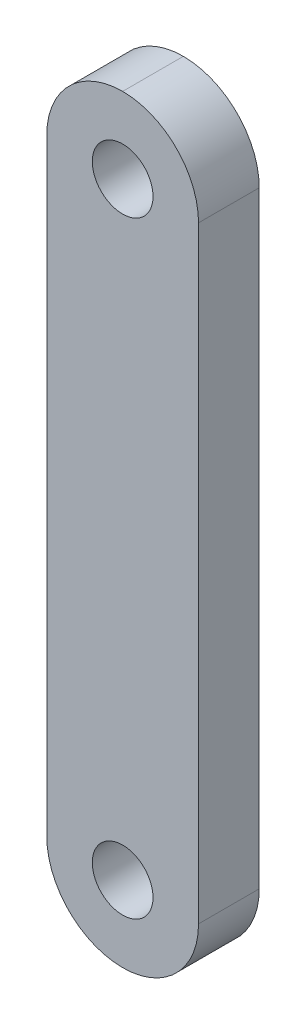
ISO-10303-21;
HEADER;
FILE_DESCRIPTION(('STEP AP214'),'2;1');
FILE_NAME('part.step','',(''),(''),'','','');
FILE_SCHEMA(('AUTOMOTIVE_DESIGN { 1 0 10303 214 1 1 1 1 }'));
ENDSEC;
DATA;
#1=APPLICATION_CONTEXT('core data for automotive mechanical design processes');
#2=APPLICATION_PROTOCOL_DEFINITION('international standard','automotive_design',2000,#1);
#3=PRODUCT_CONTEXT('',#1,'mechanical');
#4=PRODUCT('Part','Part','',(#3));
#5=PRODUCT_RELATED_PRODUCT_CATEGORY('part','',(#4));
#6=PRODUCT_DEFINITION_FORMATION('','',#4);
#7=PRODUCT_DEFINITION_CONTEXT('part definition',#1,'design');
#8=PRODUCT_DEFINITION('design','',#6,#7);
#9=PRODUCT_DEFINITION_SHAPE('','',#8);
#10=(LENGTH_UNIT() NAMED_UNIT(*) SI_UNIT(.MILLI.,.METRE.));
#11=(NAMED_UNIT(*) PLANE_ANGLE_UNIT() SI_UNIT($,.RADIAN.));
#12=(NAMED_UNIT(*) SI_UNIT($,.STERADIAN.) SOLID_ANGLE_UNIT());
#13=UNCERTAINTY_MEASURE_WITH_UNIT(LENGTH_MEASURE(1.E-05),#10,'distance_accuracy_value','');
#14=(GEOMETRIC_REPRESENTATION_CONTEXT(3) GLOBAL_UNCERTAINTY_ASSIGNED_CONTEXT((#13)) GLOBAL_UNIT_ASSIGNED_CONTEXT((#10,
#11,#12)) REPRESENTATION_CONTEXT('',''));
#15=CARTESIAN_POINT('',(0.,0.,0.));
#16=DIRECTION('',(0.,0.,1.));
#17=DIRECTION('',(1.,0.,0.));
#18=AXIS2_PLACEMENT_3D('',#15,#16,#17);
#19=CARTESIAN_POINT('',(-25.,-125.,20.));
#20=DIRECTION('',(1.,0.,0.));
#21=DIRECTION('',(0.,0.,-1.));
#22=AXIS2_PLACEMENT_3D('',#19,#20,#21);
#23=PLANE('',#22);
#24=DIRECTION('',(0.,-1.,0.));
#25=VECTOR('',#24,1.);
#26=CARTESIAN_POINT('',(-25.,-125.,0.));
#27=LINE('',#26,#25);
#28=CARTESIAN_POINT('',(-25.,100.,0.));
#29=VERTEX_POINT('',#28);
#30=CARTESIAN_POINT('',(-25.,-100.,0.));
#31=VERTEX_POINT('',#30);
#32=EDGE_CURVE('E102',#29,#31,#27,.T.);
#33=ORIENTED_EDGE('',*,*,#32,.T.);
#34=DIRECTION('',(0.,0.,-1.));
#35=VECTOR('',#34,1.);
#36=CARTESIAN_POINT('',(-25.,-100.,20.));
#37=LINE('',#36,#35);
#38=CARTESIAN_POINT('',(-25.,-100.,20.));
#39=VERTEX_POINT('',#38);
#40=EDGE_CURVE('E106',#31,#39,#37,.F.);
#41=ORIENTED_EDGE('',*,*,#40,.T.);
#42=DIRECTION('',(0.,-1.,0.));
#43=VECTOR('',#42,1.);
#44=CARTESIAN_POINT('',(-25.,-125.,20.));
#45=LINE('',#44,#43);
#46=CARTESIAN_POINT('',(-25.,100.,20.));
#47=VERTEX_POINT('',#46);
#48=EDGE_CURVE('E105',#47,#39,#45,.T.);
#49=ORIENTED_EDGE('',*,*,#48,.F.);
#50=DIRECTION('',(0.,0.,-1.));
#51=VECTOR('',#50,1.);
#52=CARTESIAN_POINT('',(-25.,100.,20.));
#53=LINE('',#52,#51);
#54=EDGE_CURVE('E91',#47,#29,#53,.T.);
#55=ORIENTED_EDGE('',*,*,#54,.T.);
#56=EDGE_LOOP('',(#33,#41,#49,#55));
#57=FACE_BOUND('',#56,.T.);
#58=ADVANCED_FACE('F32',(#57),#23,.F.);
#59=CARTESIAN_POINT('',(25.,-125.,20.));
#60=DIRECTION('',(-1.,0.,0.));
#61=DIRECTION('',(0.,0.,1.));
#62=AXIS2_PLACEMENT_3D('',#59,#60,#61);
#63=PLANE('',#62);
#64=DIRECTION('',(0.,1.,0.));
#65=VECTOR('',#64,1.);
#66=CARTESIAN_POINT('',(25.,-125.,20.));
#67=LINE('',#66,#65);
#68=CARTESIAN_POINT('',(25.,-100.,20.));
#69=VERTEX_POINT('',#68);
#70=CARTESIAN_POINT('',(25.,100.,20.));
#71=VERTEX_POINT('',#70);
#72=EDGE_CURVE('E119',#69,#71,#67,.T.);
#73=ORIENTED_EDGE('',*,*,#72,.F.);
#74=DIRECTION('',(0.,0.,-1.));
#75=VECTOR('',#74,1.);
#76=CARTESIAN_POINT('',(25.,-100.,20.));
#77=LINE('',#76,#75);
#78=CARTESIAN_POINT('',(25.,-100.,0.));
#79=VERTEX_POINT('',#78);
#80=EDGE_CURVE('E11',#69,#79,#77,.T.);
#81=ORIENTED_EDGE('',*,*,#80,.T.);
#82=DIRECTION('',(0.,1.,0.));
#83=VECTOR('',#82,1.);
#84=CARTESIAN_POINT('',(25.,-125.,0.));
#85=LINE('',#84,#83);
#86=CARTESIAN_POINT('',(25.,100.,0.));
#87=VERTEX_POINT('',#86);
#88=EDGE_CURVE('E111',#79,#87,#85,.T.);
#89=ORIENTED_EDGE('',*,*,#88,.T.);
#90=DIRECTION('',(0.,0.,-1.));
#91=VECTOR('',#90,1.);
#92=CARTESIAN_POINT('',(25.,100.,20.));
#93=LINE('',#92,#91);
#94=EDGE_CURVE('E41',#87,#71,#93,.F.);
#95=ORIENTED_EDGE('',*,*,#94,.T.);
#96=EDGE_LOOP('',(#73,#81,#89,#95));
#97=FACE_BOUND('',#96,.T.);
#98=ADVANCED_FACE('F153',(#97),#63,.F.);
#99=CARTESIAN_POINT('',(0.,0.,20.));
#100=DIRECTION('',(0.,0.,-1.));
#101=DIRECTION('',(-1.,0.,0.));
#102=AXIS2_PLACEMENT_3D('',#99,#100,#101);
#103=PLANE('',#102);
#104=CARTESIAN_POINT('',(0.,100.,20.));
#105=DIRECTION('',(0.,0.,1.));
#106=DIRECTION('',(1.,0.,0.));
#107=AXIS2_PLACEMENT_3D('',#104,#105,#106);
#108=CIRCLE('',#107,10.);
#109=CARTESIAN_POINT('',(10.,100.,20.));
#110=VERTEX_POINT('',#109);
#111=EDGE_CURVE('E139',#110,#110,#108,.T.);
#112=ORIENTED_EDGE('',*,*,#111,.F.);
#113=EDGE_LOOP('',(#112));
#114=FACE_BOUND('',#113,.T.);
#115=CARTESIAN_POINT('',(0.,-100.,20.));
#116=DIRECTION('',(0.,0.,1.));
#117=DIRECTION('',(1.,0.,0.));
#118=AXIS2_PLACEMENT_3D('',#115,#116,#117);
#119=CIRCLE('',#118,10.);
#120=CARTESIAN_POINT('',(10.,-100.,20.));
#121=VERTEX_POINT('',#120);
#122=EDGE_CURVE('E112',#121,#121,#119,.T.);
#123=ORIENTED_EDGE('',*,*,#122,.F.);
#124=EDGE_LOOP('',(#123));
#125=FACE_BOUND('',#124,.T.);
#126=ORIENTED_EDGE('',*,*,#48,.T.);
#127=CARTESIAN_POINT('',(0.,-100.,20.));
#128=DIRECTION('',(0.,0.,-1.));
#129=DIRECTION('',(-1.,0.,0.));
#130=AXIS2_PLACEMENT_3D('',#127,#128,#129);
#131=CIRCLE('',#130,25.);
#132=CARTESIAN_POINT('',(0.,-125.,20.));
#133=VERTEX_POINT('',#132);
#134=EDGE_CURVE('E131',#39,#133,#131,.F.);
#135=ORIENTED_EDGE('',*,*,#134,.T.);
#136=CARTESIAN_POINT('',(0.,-100.,20.));
#137=DIRECTION('',(0.,0.,-1.));
#138=DIRECTION('',(-1.,0.,0.));
#139=AXIS2_PLACEMENT_3D('',#136,#137,#138);
#140=CIRCLE('',#139,25.);
#141=EDGE_CURVE('E129',#133,#69,#140,.F.);
#142=ORIENTED_EDGE('',*,*,#141,.T.);
#143=ORIENTED_EDGE('',*,*,#72,.T.);
#144=CARTESIAN_POINT('',(0.,100.,20.));
#145=DIRECTION('',(0.,0.,-1.));
#146=DIRECTION('',(-1.,0.,0.));
#147=AXIS2_PLACEMENT_3D('',#144,#145,#146);
#148=CIRCLE('',#147,25.);
#149=CARTESIAN_POINT('',(0.,125.,20.));
#150=VERTEX_POINT('',#149);
#151=EDGE_CURVE('E49',#71,#150,#148,.F.);
#152=ORIENTED_EDGE('',*,*,#151,.T.);
#153=CARTESIAN_POINT('',(0.,100.,20.));
#154=DIRECTION('',(0.,0.,-1.));
#155=DIRECTION('',(-1.,0.,0.));
#156=AXIS2_PLACEMENT_3D('',#153,#154,#155);
#157=CIRCLE('',#156,25.);
#158=EDGE_CURVE('E127',#150,#47,#157,.F.);
#159=ORIENTED_EDGE('',*,*,#158,.T.);
#160=EDGE_LOOP('',(#126,#135,#142,#143,#152,#159));
#161=FACE_BOUND('',#160,.T.);
#162=ADVANCED_FACE('F147',(#114,#125,#161),#103,.F.);
#163=CARTESIAN_POINT('',(0.,0.,0.));
#164=DIRECTION('',(0.,0.,-1.));
#165=DIRECTION('',(-1.,0.,0.));
#166=AXIS2_PLACEMENT_3D('',#163,#164,#165);
#167=PLANE('',#166);
#168=CARTESIAN_POINT('',(0.,100.,0.));
#169=DIRECTION('',(0.,0.,-1.));
#170=DIRECTION('',(-1.,0.,0.));
#171=AXIS2_PLACEMENT_3D('',#168,#169,#170);
#172=CIRCLE('',#171,10.);
#173=CARTESIAN_POINT('',(-10.,100.,0.));
#174=VERTEX_POINT('',#173);
#175=EDGE_CURVE('E135',#174,#174,#172,.F.);
#176=ORIENTED_EDGE('',*,*,#175,.T.);
#177=EDGE_LOOP('',(#176));
#178=FACE_BOUND('',#177,.T.);
#179=CARTESIAN_POINT('',(0.,-100.,0.));
#180=DIRECTION('',(0.,0.,-1.));
#181=DIRECTION('',(-1.,0.,0.));
#182=AXIS2_PLACEMENT_3D('',#179,#180,#181);
#183=CIRCLE('',#182,10.);
#184=CARTESIAN_POINT('',(-10.,-100.,0.));
#185=VERTEX_POINT('',#184);
#186=EDGE_CURVE('E116',#185,#185,#183,.F.);
#187=ORIENTED_EDGE('',*,*,#186,.T.);
#188=EDGE_LOOP('',(#187));
#189=FACE_BOUND('',#188,.T.);
#190=CARTESIAN_POINT('',(0.,-100.,0.));
#191=DIRECTION('',(0.,0.,-1.));
#192=DIRECTION('',(-1.,0.,0.));
#193=AXIS2_PLACEMENT_3D('',#190,#191,#192);
#194=CIRCLE('',#193,25.);
#195=CARTESIAN_POINT('',(0.,-125.,0.));
#196=VERTEX_POINT('',#195);
#197=EDGE_CURVE('E95',#79,#196,#194,.T.);
#198=ORIENTED_EDGE('',*,*,#197,.T.);
#199=CARTESIAN_POINT('',(0.,-100.,0.));
#200=DIRECTION('',(0.,0.,-1.));
#201=DIRECTION('',(-1.,0.,0.));
#202=AXIS2_PLACEMENT_3D('',#199,#200,#201);
#203=CIRCLE('',#202,25.);
#204=EDGE_CURVE('E107',#196,#31,#203,.T.);
#205=ORIENTED_EDGE('',*,*,#204,.T.);
#206=ORIENTED_EDGE('',*,*,#32,.F.);
#207=CARTESIAN_POINT('',(0.,100.,0.));
#208=DIRECTION('',(0.,0.,-1.));
#209=DIRECTION('',(-1.,0.,0.));
#210=AXIS2_PLACEMENT_3D('',#207,#208,#209);
#211=CIRCLE('',#210,25.);
#212=CARTESIAN_POINT('',(0.,125.,0.));
#213=VERTEX_POINT('',#212);
#214=EDGE_CURVE('E87',#29,#213,#211,.T.);
#215=ORIENTED_EDGE('',*,*,#214,.T.);
#216=CARTESIAN_POINT('',(0.,100.,0.));
#217=DIRECTION('',(0.,0.,-1.));
#218=DIRECTION('',(-1.,0.,0.));
#219=AXIS2_PLACEMENT_3D('',#216,#217,#218);
#220=CIRCLE('',#219,25.);
#221=EDGE_CURVE('E96',#213,#87,#220,.T.);
#222=ORIENTED_EDGE('',*,*,#221,.T.);
#223=ORIENTED_EDGE('',*,*,#88,.F.);
#224=EDGE_LOOP('',(#198,#205,#206,#215,#222,#223));
#225=FACE_BOUND('',#224,.T.);
#226=ADVANCED_FACE('F109',(#178,#189,#225),#167,.T.);
#227=CARTESIAN_POINT('',(0.,-100.,-0.001000000000001));
#228=DIRECTION('',(0.,0.,1.));
#229=DIRECTION('',(1.,0.,0.));
#230=AXIS2_PLACEMENT_3D('',#227,#228,#229);
#231=CYLINDRICAL_SURFACE('',#230,10.);
#232=ORIENTED_EDGE('',*,*,#186,.F.);
#233=EDGE_LOOP('',(#232));
#234=FACE_BOUND('',#233,.T.);
#235=ORIENTED_EDGE('',*,*,#122,.T.);
#236=EDGE_LOOP('',(#235));
#237=FACE_BOUND('',#236,.T.);
#238=ADVANCED_FACE('F174',(#234,#237),#231,.F.);
#239=CARTESIAN_POINT('',(0.,100.,-0.001000000000001));
#240=DIRECTION('',(0.,0.,1.));
#241=DIRECTION('',(1.,0.,0.));
#242=AXIS2_PLACEMENT_3D('',#239,#240,#241);
#243=CYLINDRICAL_SURFACE('',#242,10.);
#244=ORIENTED_EDGE('',*,*,#175,.F.);
#245=EDGE_LOOP('',(#244));
#246=FACE_BOUND('',#245,.T.);
#247=ORIENTED_EDGE('',*,*,#111,.T.);
#248=EDGE_LOOP('',(#247));
#249=FACE_BOUND('',#248,.T.);
#250=ADVANCED_FACE('F163',(#246,#249),#243,.F.);
#251=CARTESIAN_POINT('',(0.,-100.,20.));
#252=DIRECTION('',(0.,0.,-1.));
#253=DIRECTION('',(-1.,0.,0.));
#254=AXIS2_PLACEMENT_3D('',#251,#252,#253);
#255=CYLINDRICAL_SURFACE('',#254,25.);
#256=ORIENTED_EDGE('',*,*,#80,.F.);
#257=ORIENTED_EDGE('',*,*,#141,.F.);
#258=DIRECTION('',(0.,0.,-1.));
#259=VECTOR('',#258,1.);
#260=CARTESIAN_POINT('',(0.,-125.,20.));
#261=LINE('',#260,#259);
#262=EDGE_CURVE('E133',#196,#133,#261,.F.);
#263=ORIENTED_EDGE('',*,*,#262,.F.);
#264=ORIENTED_EDGE('',*,*,#197,.F.);
#265=EDGE_LOOP('',(#256,#257,#263,#264));
#266=FACE_BOUND('',#265,.T.);
#267=ADVANCED_FACE('F155',(#266),#255,.T.);
#268=CARTESIAN_POINT('',(0.,-100.,20.));
#269=DIRECTION('',(0.,0.,-1.));
#270=DIRECTION('',(-1.,0.,0.));
#271=AXIS2_PLACEMENT_3D('',#268,#269,#270);
#272=CYLINDRICAL_SURFACE('',#271,25.);
#273=ORIENTED_EDGE('',*,*,#134,.F.);
#274=ORIENTED_EDGE('',*,*,#40,.F.);
#275=ORIENTED_EDGE('',*,*,#204,.F.);
#276=ORIENTED_EDGE('',*,*,#262,.T.);
#277=EDGE_LOOP('',(#273,#274,#275,#276));
#278=FACE_BOUND('',#277,.T.);
#279=ADVANCED_FACE('F156',(#278),#272,.T.);
#280=CARTESIAN_POINT('',(0.,100.,20.));
#281=DIRECTION('',(0.,0.,-1.));
#282=DIRECTION('',(-1.,0.,0.));
#283=AXIS2_PLACEMENT_3D('',#280,#281,#282);
#284=CYLINDRICAL_SURFACE('',#283,25.);
#285=DIRECTION('',(0.,0.,-1.));
#286=VECTOR('',#285,1.);
#287=CARTESIAN_POINT('',(0.,125.,20.));
#288=LINE('',#287,#286);
#289=EDGE_CURVE('E36',#150,#213,#288,.T.);
#290=ORIENTED_EDGE('',*,*,#289,.F.);
#291=ORIENTED_EDGE('',*,*,#151,.F.);
#292=ORIENTED_EDGE('',*,*,#94,.F.);
#293=ORIENTED_EDGE('',*,*,#221,.F.);
#294=EDGE_LOOP('',(#290,#291,#292,#293));
#295=FACE_BOUND('',#294,.T.);
#296=ADVANCED_FACE('F34',(#295),#284,.T.);
#297=CARTESIAN_POINT('',(0.,100.,20.));
#298=DIRECTION('',(0.,0.,-1.));
#299=DIRECTION('',(-1.,0.,0.));
#300=AXIS2_PLACEMENT_3D('',#297,#298,#299);
#301=CYLINDRICAL_SURFACE('',#300,25.);
#302=ORIENTED_EDGE('',*,*,#158,.F.);
#303=ORIENTED_EDGE('',*,*,#289,.T.);
#304=ORIENTED_EDGE('',*,*,#214,.F.);
#305=ORIENTED_EDGE('',*,*,#54,.F.);
#306=EDGE_LOOP('',(#302,#303,#304,#305));
#307=FACE_BOUND('',#306,.T.);
#308=ADVANCED_FACE('F90',(#307),#301,.T.);
#309=CLOSED_SHELL('',(#58,#98,#162,#226,#238,#250,#267,#279,#296,#308));
#310=MANIFOLD_SOLID_BREP('B2',#309);
#311=ADVANCED_BREP_SHAPE_REPRESENTATION('',(#18,#310),#14);
#312=SHAPE_DEFINITION_REPRESENTATION(#9,#311);
ENDSEC;
END-ISO-10303-21;
